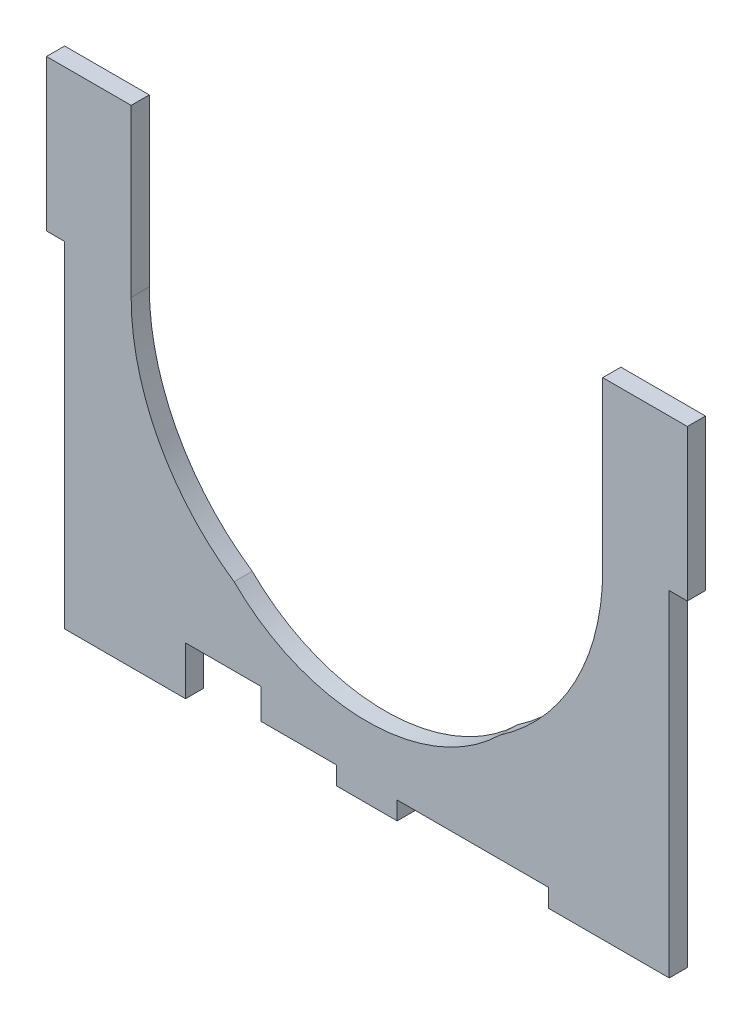
ISO-10303-21;
HEADER;
FILE_DESCRIPTION(('STEP AP214'),'2;1');
FILE_NAME('part.step','',(''),(''),'','','');
FILE_SCHEMA(('AUTOMOTIVE_DESIGN { 1 0 10303 214 1 1 1 1 }'));
ENDSEC;
DATA;
#1=APPLICATION_CONTEXT('core data for automotive mechanical design processes');
#2=APPLICATION_PROTOCOL_DEFINITION('international standard','automotive_design',2000,#1);
#3=PRODUCT_CONTEXT('',#1,'mechanical');
#4=PRODUCT('Part','Part','',(#3));
#5=PRODUCT_RELATED_PRODUCT_CATEGORY('part','',(#4));
#6=PRODUCT_DEFINITION_FORMATION('','',#4);
#7=PRODUCT_DEFINITION_CONTEXT('part definition',#1,'design');
#8=PRODUCT_DEFINITION('design','',#6,#7);
#9=PRODUCT_DEFINITION_SHAPE('','',#8);
#10=(LENGTH_UNIT() NAMED_UNIT(*) SI_UNIT(.MILLI.,.METRE.));
#11=(NAMED_UNIT(*) PLANE_ANGLE_UNIT() SI_UNIT($,.RADIAN.));
#12=(NAMED_UNIT(*) SI_UNIT($,.STERADIAN.) SOLID_ANGLE_UNIT());
#13=UNCERTAINTY_MEASURE_WITH_UNIT(LENGTH_MEASURE(1.E-05),#10,'distance_accuracy_value','');
#14=(GEOMETRIC_REPRESENTATION_CONTEXT(3) GLOBAL_UNCERTAINTY_ASSIGNED_CONTEXT((#13)) GLOBAL_UNIT_ASSIGNED_CONTEXT((#10,
#11,#12)) REPRESENTATION_CONTEXT('',''));
#15=CARTESIAN_POINT('',(0.,0.,0.));
#16=DIRECTION('',(0.,0.,1.));
#17=DIRECTION('',(1.,0.,0.));
#18=AXIS2_PLACEMENT_3D('',#15,#16,#17);
#19=CARTESIAN_POINT('',(0.,0.,6.));
#20=DIRECTION('',(0.,1.,0.));
#21=DIRECTION('',(-1.,0.,0.));
#22=AXIS2_PLACEMENT_3D('',#19,#20,#21);
#23=PLANE('',#22);
#24=DIRECTION('',(1.,0.,0.));
#25=VECTOR('',#24,1.);
#26=CARTESIAN_POINT('',(0.,0.,6.));
#27=LINE('',#26,#25);
#28=CARTESIAN_POINT('',(-135.,0.,6.));
#29=VERTEX_POINT('',#28);
#30=CARTESIAN_POINT('',(-110.,0.,6.));
#31=VERTEX_POINT('',#30);
#32=EDGE_CURVE('E219',#29,#31,#27,.T.);
#33=ORIENTED_EDGE('',*,*,#32,.F.);
#34=DIRECTION('',(0.,0.,1.));
#35=VECTOR('',#34,1.);
#36=CARTESIAN_POINT('',(-135.,0.,-4.));
#37=LINE('',#36,#35);
#38=CARTESIAN_POINT('',(-135.,0.,0.));
#39=VERTEX_POINT('',#38);
#40=EDGE_CURVE('E202',#39,#29,#37,.T.);
#41=ORIENTED_EDGE('',*,*,#40,.F.);
#42=DIRECTION('',(1.,0.,0.));
#43=VECTOR('',#42,1.);
#44=CARTESIAN_POINT('',(0.,0.,0.));
#45=LINE('',#44,#43);
#46=CARTESIAN_POINT('',(-110.,0.,0.));
#47=VERTEX_POINT('',#46);
#48=EDGE_CURVE('E269',#39,#47,#45,.T.);
#49=ORIENTED_EDGE('',*,*,#48,.T.);
#50=DIRECTION('',(0.,0.,1.));
#51=VECTOR('',#50,1.);
#52=CARTESIAN_POINT('',(-110.,0.,0.));
#53=LINE('',#52,#51);
#54=EDGE_CURVE('E225',#47,#31,#53,.T.);
#55=ORIENTED_EDGE('',*,*,#54,.T.);
#56=EDGE_LOOP('',(#33,#41,#49,#55));
#57=FACE_BOUND('',#56,.T.);
#58=ADVANCED_FACE('F42',(#57),#23,.F.);
#59=CARTESIAN_POINT('',(-90.,0.,0.));
#60=VERTEX_POINT('',#59);
#61=CARTESIAN_POINT('',(-40.,0.,0.));
#62=VERTEX_POINT('',#61);
#63=EDGE_CURVE('E63',#60,#62,#45,.T.);
#64=ORIENTED_EDGE('',*,*,#63,.T.);
#65=DIRECTION('',(0.,0.,1.));
#66=VECTOR('',#65,1.);
#67=CARTESIAN_POINT('',(-40.,0.,0.));
#68=LINE('',#67,#66);
#69=CARTESIAN_POINT('',(-40.,0.,6.));
#70=VERTEX_POINT('',#69);
#71=EDGE_CURVE('E58',#62,#70,#68,.T.);
#72=ORIENTED_EDGE('',*,*,#71,.T.);
#73=CARTESIAN_POINT('',(-90.,0.,6.));
#74=VERTEX_POINT('',#73);
#75=EDGE_CURVE('E229',#74,#70,#27,.T.);
#76=ORIENTED_EDGE('',*,*,#75,.F.);
#77=DIRECTION('',(0.,0.,1.));
#78=VECTOR('',#77,1.);
#79=CARTESIAN_POINT('',(-90.,0.,0.));
#80=LINE('',#79,#78);
#81=EDGE_CURVE('E303',#60,#74,#80,.T.);
#82=ORIENTED_EDGE('',*,*,#81,.F.);
#83=EDGE_LOOP('',(#64,#72,#76,#82));
#84=FACE_BOUND('',#83,.T.);
#85=ADVANCED_FACE('F556',(#84),#23,.F.);
#86=CARTESIAN_POINT('',(-200.,0.,6.));
#87=DIRECTION('',(1.,0.,0.));
#88=DIRECTION('',(0.,0.,-1.));
#89=AXIS2_PLACEMENT_3D('',#86,#87,#88);
#90=PLANE('',#89);
#91=DIRECTION('',(0.,0.,1.));
#92=VECTOR('',#91,1.);
#93=CARTESIAN_POINT('',(-200.,105.,0.));
#94=LINE('',#93,#92);
#95=CARTESIAN_POINT('',(-200.,105.,0.));
#96=VERTEX_POINT('',#95);
#97=CARTESIAN_POINT('',(-200.,105.,6.));
#98=VERTEX_POINT('',#97);
#99=EDGE_CURVE('E245',#96,#98,#94,.T.);
#100=ORIENTED_EDGE('',*,*,#99,.F.);
#101=DIRECTION('',(0.,-1.,0.));
#102=VECTOR('',#101,1.);
#103=CARTESIAN_POINT('',(-200.,0.,0.));
#104=LINE('',#103,#102);
#105=CARTESIAN_POINT('',(-200.,-5.99999999999998,0.));
#106=VERTEX_POINT('',#105);
#107=EDGE_CURVE('E266',#96,#106,#104,.T.);
#108=ORIENTED_EDGE('',*,*,#107,.T.);
#109=DIRECTION('',(0.,0.,1.));
#110=VECTOR('',#109,1.);
#111=CARTESIAN_POINT('',(-200.,-5.99999999999998,0.));
#112=LINE('',#111,#110);
#113=CARTESIAN_POINT('',(-200.,-5.99999999999998,6.));
#114=VERTEX_POINT('',#113);
#115=EDGE_CURVE('E346',#106,#114,#112,.T.);
#116=ORIENTED_EDGE('',*,*,#115,.T.);
#117=DIRECTION('',(0.,-1.,0.));
#118=VECTOR('',#117,1.);
#119=CARTESIAN_POINT('',(-200.,0.,6.));
#120=LINE('',#119,#118);
#121=EDGE_CURVE('E236',#98,#114,#120,.T.);
#122=ORIENTED_EDGE('',*,*,#121,.F.);
#123=EDGE_LOOP('',(#100,#108,#116,#122));
#124=FACE_BOUND('',#123,.T.);
#125=ADVANCED_FACE('F439',(#124),#90,.F.);
#126=CARTESIAN_POINT('',(0.,0.,6.));
#127=DIRECTION('',(-1.,0.,0.));
#128=DIRECTION('',(0.,-1.,0.));
#129=AXIS2_PLACEMENT_3D('',#126,#127,#128);
#130=PLANE('',#129);
#131=DIRECTION('',(0.,1.,0.));
#132=VECTOR('',#131,1.);
#133=CARTESIAN_POINT('',(0.,0.,0.));
#134=LINE('',#133,#132);
#135=CARTESIAN_POINT('',(0.,-5.99999999999998,0.));
#136=VERTEX_POINT('',#135);
#137=CARTESIAN_POINT('',(0.,105.,0.));
#138=VERTEX_POINT('',#137);
#139=EDGE_CURVE('E240',#136,#138,#134,.T.);
#140=ORIENTED_EDGE('',*,*,#139,.T.);
#141=DIRECTION('',(0.,0.,1.));
#142=VECTOR('',#141,1.);
#143=CARTESIAN_POINT('',(0.,105.,0.));
#144=LINE('',#143,#142);
#145=CARTESIAN_POINT('',(0.,105.,6.));
#146=VERTEX_POINT('',#145);
#147=EDGE_CURVE('E379',#138,#146,#144,.T.);
#148=ORIENTED_EDGE('',*,*,#147,.T.);
#149=DIRECTION('',(0.,1.,0.));
#150=VECTOR('',#149,1.);
#151=CARTESIAN_POINT('',(0.,0.,6.));
#152=LINE('',#151,#150);
#153=CARTESIAN_POINT('',(0.,-5.99999999999998,6.));
#154=VERTEX_POINT('',#153);
#155=EDGE_CURVE('E271',#154,#146,#152,.T.);
#156=ORIENTED_EDGE('',*,*,#155,.F.);
#157=DIRECTION('',(0.,0.,1.));
#158=VECTOR('',#157,1.);
#159=CARTESIAN_POINT('',(0.,-5.99999999999998,0.));
#160=LINE('',#159,#158);
#161=EDGE_CURVE('E452',#136,#154,#160,.T.);
#162=ORIENTED_EDGE('',*,*,#161,.F.);
#163=EDGE_LOOP('',(#140,#148,#156,#162));
#164=FACE_BOUND('',#163,.T.);
#165=ADVANCED_FACE('F44',(#164),#130,.F.);
#166=CARTESIAN_POINT('',(0.,155.,6.));
#167=DIRECTION('',(0.,-1.,0.));
#168=DIRECTION('',(0.,0.,-1.));
#169=AXIS2_PLACEMENT_3D('',#166,#167,#168);
#170=PLANE('',#169);
#171=DIRECTION('',(-1.,0.,0.));
#172=VECTOR('',#171,1.);
#173=CARTESIAN_POINT('',(0.,155.,0.));
#174=LINE('',#173,#172);
#175=CARTESIAN_POINT('',(6.00000000000003,155.,0.));
#176=VERTEX_POINT('',#175);
#177=CARTESIAN_POINT('',(-21.9999999999999,155.,0.));
#178=VERTEX_POINT('',#177);
#179=EDGE_CURVE('E244',#176,#178,#174,.T.);
#180=ORIENTED_EDGE('',*,*,#179,.T.);
#181=DIRECTION('',(0.,0.,-1.));
#182=VECTOR('',#181,1.);
#183=CARTESIAN_POINT('',(-21.9999999999999,155.,6.));
#184=LINE('',#183,#182);
#185=CARTESIAN_POINT('',(-21.9999999999999,155.,6.));
#186=VERTEX_POINT('',#185);
#187=EDGE_CURVE('E288',#186,#178,#184,.T.);
#188=ORIENTED_EDGE('',*,*,#187,.F.);
#189=DIRECTION('',(-1.,0.,0.));
#190=VECTOR('',#189,1.);
#191=CARTESIAN_POINT('',(0.,155.,6.));
#192=LINE('',#191,#190);
#193=CARTESIAN_POINT('',(6.00000000000003,155.,6.));
#194=VERTEX_POINT('',#193);
#195=EDGE_CURVE('E414',#194,#186,#192,.T.);
#196=ORIENTED_EDGE('',*,*,#195,.F.);
#197=DIRECTION('',(0.,0.,1.));
#198=VECTOR('',#197,1.);
#199=CARTESIAN_POINT('',(6.00000000000003,155.,0.));
#200=LINE('',#199,#198);
#201=EDGE_CURVE('E368',#176,#194,#200,.T.);
#202=ORIENTED_EDGE('',*,*,#201,.F.);
#203=EDGE_LOOP('',(#180,#188,#196,#202));
#204=FACE_BOUND('',#203,.T.);
#205=ADVANCED_FACE('F511',(#204),#170,.F.);
#206=CARTESIAN_POINT('',(-22.,100.,6.));
#207=DIRECTION('',(1.,0.,0.));
#208=DIRECTION('',(0.,1.,0.));
#209=AXIS2_PLACEMENT_3D('',#206,#207,#208);
#210=PLANE('',#209);
#211=DIRECTION('',(0.,-1.,0.));
#212=VECTOR('',#211,1.);
#213=CARTESIAN_POINT('',(-22.,100.,0.));
#214=LINE('',#213,#212);
#215=CARTESIAN_POINT('',(-22.,100.,0.));
#216=VERTEX_POINT('',#215);
#217=EDGE_CURVE('E248',#178,#216,#214,.T.);
#218=ORIENTED_EDGE('',*,*,#217,.T.);
#219=DIRECTION('',(0.,0.,-1.));
#220=VECTOR('',#219,1.);
#221=CARTESIAN_POINT('',(-22.,100.,6.));
#222=LINE('',#221,#220);
#223=CARTESIAN_POINT('',(-22.,100.,6.));
#224=VERTEX_POINT('',#223);
#225=EDGE_CURVE('E284',#224,#216,#222,.T.);
#226=ORIENTED_EDGE('',*,*,#225,.F.);
#227=DIRECTION('',(0.,-1.,0.));
#228=VECTOR('',#227,1.);
#229=CARTESIAN_POINT('',(-22.,100.,6.));
#230=LINE('',#229,#228);
#231=EDGE_CURVE('E417',#186,#224,#230,.T.);
#232=ORIENTED_EDGE('',*,*,#231,.F.);
#233=ORIENTED_EDGE('',*,*,#187,.T.);
#234=EDGE_LOOP('',(#218,#226,#232,#233));
#235=FACE_BOUND('',#234,.T.);
#236=ADVANCED_FACE('F513',(#235),#210,.F.);
#237=CARTESIAN_POINT('',(-100.,100.,6.));
#238=DIRECTION('',(0.,0.,-1.));
#239=DIRECTION('',(-1.,0.,0.));
#240=AXIS2_PLACEMENT_3D('',#237,#238,#239);
#241=CYLINDRICAL_SURFACE('',#240,78.);
#242=CARTESIAN_POINT('',(-100.,100.,0.));
#243=DIRECTION('',(0.,0.,-1.));
#244=DIRECTION('',(1.,0.,0.));
#245=AXIS2_PLACEMENT_3D('',#242,#243,#244);
#246=CIRCLE('',#245,78.);
#247=CARTESIAN_POINT('',(-56.0568198017314,35.55625,0.));
#248=VERTEX_POINT('',#247);
#249=EDGE_CURVE('E251',#216,#248,#246,.T.);
#250=ORIENTED_EDGE('',*,*,#249,.T.);
#251=DIRECTION('',(0.,0.,-1.));
#252=VECTOR('',#251,1.);
#253=CARTESIAN_POINT('',(-56.0568198017314,35.55625,6.));
#254=LINE('',#253,#252);
#255=CARTESIAN_POINT('',(-56.0568198017314,35.55625,6.));
#256=VERTEX_POINT('',#255);
#257=EDGE_CURVE('E280',#256,#248,#254,.T.);
#258=ORIENTED_EDGE('',*,*,#257,.F.);
#259=CARTESIAN_POINT('',(-100.,100.,6.));
#260=DIRECTION('',(0.,0.,-1.));
#261=DIRECTION('',(1.,0.,0.));
#262=AXIS2_PLACEMENT_3D('',#259,#260,#261);
#263=CIRCLE('',#262,78.);
#264=EDGE_CURVE('E420',#224,#256,#263,.T.);
#265=ORIENTED_EDGE('',*,*,#264,.F.);
#266=ORIENTED_EDGE('',*,*,#225,.T.);
#267=EDGE_LOOP('',(#250,#258,#265,#266));
#268=FACE_BOUND('',#267,.T.);
#269=ADVANCED_FACE('F518',(#268),#241,.F.);
#270=CARTESIAN_POINT('',(-100.,80.,6.));
#271=DIRECTION('',(0.,0.,-1.));
#272=DIRECTION('',(-1.,0.,0.));
#273=AXIS2_PLACEMENT_3D('',#270,#271,#272);
#274=CYLINDRICAL_SURFACE('',#273,62.5);
#275=CARTESIAN_POINT('',(-100.,80.,0.));
#276=DIRECTION('',(0.,0.,-1.));
#277=DIRECTION('',(1.,0.,0.));
#278=AXIS2_PLACEMENT_3D('',#275,#276,#277);
#279=CIRCLE('',#278,62.5);
#280=CARTESIAN_POINT('',(-143.943180198269,35.55625,0.));
#281=VERTEX_POINT('',#280);
#282=EDGE_CURVE('E254',#248,#281,#279,.T.);
#283=ORIENTED_EDGE('',*,*,#282,.T.);
#284=DIRECTION('',(0.,0.,-1.));
#285=VECTOR('',#284,1.);
#286=CARTESIAN_POINT('',(-143.943180198269,35.55625,6.));
#287=LINE('',#286,#285);
#288=CARTESIAN_POINT('',(-143.943180198269,35.55625,6.));
#289=VERTEX_POINT('',#288);
#290=EDGE_CURVE('E276',#289,#281,#287,.T.);
#291=ORIENTED_EDGE('',*,*,#290,.F.);
#292=CARTESIAN_POINT('',(-100.,80.,6.));
#293=DIRECTION('',(0.,0.,-1.));
#294=DIRECTION('',(1.,0.,0.));
#295=AXIS2_PLACEMENT_3D('',#292,#293,#294);
#296=CIRCLE('',#295,62.5);
#297=EDGE_CURVE('E423',#256,#289,#296,.T.);
#298=ORIENTED_EDGE('',*,*,#297,.F.);
#299=ORIENTED_EDGE('',*,*,#257,.T.);
#300=EDGE_LOOP('',(#283,#291,#298,#299));
#301=FACE_BOUND('',#300,.T.);
#302=ADVANCED_FACE('F524',(#301),#274,.F.);
#303=CARTESIAN_POINT('',(-100.,100.,6.));
#304=DIRECTION('',(0.,0.,-1.));
#305=DIRECTION('',(-1.,0.,0.));
#306=AXIS2_PLACEMENT_3D('',#303,#304,#305);
#307=CYLINDRICAL_SURFACE('',#306,78.);
#308=CARTESIAN_POINT('',(-100.,100.,0.));
#309=DIRECTION('',(0.,0.,-1.));
#310=DIRECTION('',(1.,0.,0.));
#311=AXIS2_PLACEMENT_3D('',#308,#309,#310);
#312=CIRCLE('',#311,78.);
#313=CARTESIAN_POINT('',(-178.,100.,0.));
#314=VERTEX_POINT('',#313);
#315=EDGE_CURVE('E257',#281,#314,#312,.T.);
#316=ORIENTED_EDGE('',*,*,#315,.T.);
#317=DIRECTION('',(0.,0.,-1.));
#318=VECTOR('',#317,1.);
#319=CARTESIAN_POINT('',(-178.,100.,6.));
#320=LINE('',#319,#318);
#321=CARTESIAN_POINT('',(-178.,100.,6.));
#322=VERTEX_POINT('',#321);
#323=EDGE_CURVE('E234',#322,#314,#320,.T.);
#324=ORIENTED_EDGE('',*,*,#323,.F.);
#325=CARTESIAN_POINT('',(-100.,100.,6.));
#326=DIRECTION('',(0.,0.,-1.));
#327=DIRECTION('',(1.,0.,0.));
#328=AXIS2_PLACEMENT_3D('',#325,#326,#327);
#329=CIRCLE('',#328,78.);
#330=EDGE_CURVE('E426',#289,#322,#329,.T.);
#331=ORIENTED_EDGE('',*,*,#330,.F.);
#332=ORIENTED_EDGE('',*,*,#290,.T.);
#333=EDGE_LOOP('',(#316,#324,#331,#332));
#334=FACE_BOUND('',#333,.T.);
#335=ADVANCED_FACE('F528',(#334),#307,.F.);
#336=CARTESIAN_POINT('',(-178.,100.,6.));
#337=DIRECTION('',(-1.,0.,0.));
#338=DIRECTION('',(0.,-1.,0.));
#339=AXIS2_PLACEMENT_3D('',#336,#337,#338);
#340=PLANE('',#339);
#341=DIRECTION('',(0.,1.,0.));
#342=VECTOR('',#341,1.);
#343=CARTESIAN_POINT('',(-178.,100.,0.));
#344=LINE('',#343,#342);
#345=CARTESIAN_POINT('',(-178.,155.,0.));
#346=VERTEX_POINT('',#345);
#347=EDGE_CURVE('E260',#314,#346,#344,.T.);
#348=ORIENTED_EDGE('',*,*,#347,.T.);
#349=DIRECTION('',(0.,0.,-1.));
#350=VECTOR('',#349,1.);
#351=CARTESIAN_POINT('',(-178.,155.,6.));
#352=LINE('',#351,#350);
#353=CARTESIAN_POINT('',(-178.,155.,6.));
#354=VERTEX_POINT('',#353);
#355=EDGE_CURVE('E228',#354,#346,#352,.T.);
#356=ORIENTED_EDGE('',*,*,#355,.F.);
#357=DIRECTION('',(0.,1.,0.));
#358=VECTOR('',#357,1.);
#359=CARTESIAN_POINT('',(-178.,100.,6.));
#360=LINE('',#359,#358);
#361=EDGE_CURVE('E429',#322,#354,#360,.T.);
#362=ORIENTED_EDGE('',*,*,#361,.F.);
#363=ORIENTED_EDGE('',*,*,#323,.T.);
#364=EDGE_LOOP('',(#348,#356,#362,#363));
#365=FACE_BOUND('',#364,.T.);
#366=ADVANCED_FACE('F533',(#365),#340,.F.);
#367=CARTESIAN_POINT('',(-178.,155.,6.));
#368=DIRECTION('',(0.,-1.,0.));
#369=DIRECTION('',(0.,0.,-1.));
#370=AXIS2_PLACEMENT_3D('',#367,#368,#369);
#371=PLANE('',#370);
#372=DIRECTION('',(-1.,0.,0.));
#373=VECTOR('',#372,1.);
#374=CARTESIAN_POINT('',(-178.,155.,0.));
#375=LINE('',#374,#373);
#376=CARTESIAN_POINT('',(-206.,155.,0.));
#377=VERTEX_POINT('',#376);
#378=EDGE_CURVE('E263',#346,#377,#375,.T.);
#379=ORIENTED_EDGE('',*,*,#378,.T.);
#380=DIRECTION('',(0.,0.,1.));
#381=VECTOR('',#380,1.);
#382=CARTESIAN_POINT('',(-206.,155.,0.));
#383=LINE('',#382,#381);
#384=CARTESIAN_POINT('',(-206.,155.,6.));
#385=VERTEX_POINT('',#384);
#386=EDGE_CURVE('E395',#377,#385,#383,.T.);
#387=ORIENTED_EDGE('',*,*,#386,.T.);
#388=DIRECTION('',(-1.,0.,0.));
#389=VECTOR('',#388,1.);
#390=CARTESIAN_POINT('',(-178.,155.,6.));
#391=LINE('',#390,#389);
#392=EDGE_CURVE('E431',#354,#385,#391,.T.);
#393=ORIENTED_EDGE('',*,*,#392,.F.);
#394=ORIENTED_EDGE('',*,*,#355,.T.);
#395=EDGE_LOOP('',(#379,#387,#393,#394));
#396=FACE_BOUND('',#395,.T.);
#397=ADVANCED_FACE('F536',(#396),#371,.F.);
#398=CARTESIAN_POINT('',(-100.,100.,6.));
#399=DIRECTION('',(0.,0.,1.));
#400=DIRECTION('',(1.,0.,0.));
#401=AXIS2_PLACEMENT_3D('',#398,#399,#400);
#402=PLANE('',#401);
#403=DIRECTION('',(0.,1.,0.));
#404=VECTOR('',#403,1.);
#405=CARTESIAN_POINT('',(-160.,0.,6.));
#406=LINE('',#405,#404);
#407=CARTESIAN_POINT('',(-160.,-5.99999999999998,6.));
#408=VERTEX_POINT('',#407);
#409=CARTESIAN_POINT('',(-160.,10.,6.));
#410=VERTEX_POINT('',#409);
#411=EDGE_CURVE('E343',#408,#410,#406,.T.);
#412=ORIENTED_EDGE('',*,*,#411,.T.);
#413=DIRECTION('',(-1.,0.,0.));
#414=VECTOR('',#413,1.);
#415=CARTESIAN_POINT('',(-160.,10.,6.));
#416=LINE('',#415,#414);
#417=CARTESIAN_POINT('',(-135.,10.,6.));
#418=VERTEX_POINT('',#417);
#419=EDGE_CURVE('E214',#418,#410,#416,.T.);
#420=ORIENTED_EDGE('',*,*,#419,.F.);
#421=DIRECTION('',(0.,1.,0.));
#422=VECTOR('',#421,1.);
#423=CARTESIAN_POINT('',(-135.,0.,6.));
#424=LINE('',#423,#422);
#425=EDGE_CURVE('E206',#29,#418,#424,.T.);
#426=ORIENTED_EDGE('',*,*,#425,.F.);
#427=ORIENTED_EDGE('',*,*,#32,.T.);
#428=DIRECTION('',(0.,-1.,0.));
#429=VECTOR('',#428,1.);
#430=CARTESIAN_POINT('',(-110.,0.,6.));
#431=LINE('',#430,#429);
#432=CARTESIAN_POINT('',(-110.,-5.99999999999998,6.));
#433=VERTEX_POINT('',#432);
#434=EDGE_CURVE('E301',#31,#433,#431,.T.);
#435=ORIENTED_EDGE('',*,*,#434,.T.);
#436=DIRECTION('',(1.,0.,0.));
#437=VECTOR('',#436,1.);
#438=CARTESIAN_POINT('',(-110.,-5.99999999999998,6.));
#439=LINE('',#438,#437);
#440=CARTESIAN_POINT('',(-90.,-5.99999999999997,6.));
#441=VERTEX_POINT('',#440);
#442=EDGE_CURVE('E320',#433,#441,#439,.T.);
#443=ORIENTED_EDGE('',*,*,#442,.T.);
#444=DIRECTION('',(0.,1.,0.));
#445=VECTOR('',#444,1.);
#446=CARTESIAN_POINT('',(-90.,0.,6.));
#447=LINE('',#446,#445);
#448=EDGE_CURVE('E316',#441,#74,#447,.T.);
#449=ORIENTED_EDGE('',*,*,#448,.T.);
#450=ORIENTED_EDGE('',*,*,#75,.T.);
#451=DIRECTION('',(0.,-1.,0.));
#452=VECTOR('',#451,1.);
#453=CARTESIAN_POINT('',(-40.,0.,6.));
#454=LINE('',#453,#452);
#455=CARTESIAN_POINT('',(-40.,-5.99999999999998,6.));
#456=VERTEX_POINT('',#455);
#457=EDGE_CURVE('E304',#70,#456,#454,.T.);
#458=ORIENTED_EDGE('',*,*,#457,.T.);
#459=DIRECTION('',(1.,0.,0.));
#460=VECTOR('',#459,1.);
#461=CARTESIAN_POINT('',(0.,-5.99999999999998,6.));
#462=LINE('',#461,#460);
#463=EDGE_CURVE('E312',#456,#154,#462,.T.);
#464=ORIENTED_EDGE('',*,*,#463,.T.);
#465=ORIENTED_EDGE('',*,*,#155,.T.);
#466=DIRECTION('',(1.,0.,0.));
#467=VECTOR('',#466,1.);
#468=CARTESIAN_POINT('',(6.00000000000003,105.,6.));
#469=LINE('',#468,#467);
#470=CARTESIAN_POINT('',(6.00000000000003,105.,6.));
#471=VERTEX_POINT('',#470);
#472=EDGE_CURVE('E364',#146,#471,#469,.T.);
#473=ORIENTED_EDGE('',*,*,#472,.T.);
#474=DIRECTION('',(0.,1.,0.));
#475=VECTOR('',#474,1.);
#476=CARTESIAN_POINT('',(6.00000000000003,155.,6.));
#477=LINE('',#476,#475);
#478=EDGE_CURVE('E355',#471,#194,#477,.T.);
#479=ORIENTED_EDGE('',*,*,#478,.T.);
#480=ORIENTED_EDGE('',*,*,#195,.T.);
#481=ORIENTED_EDGE('',*,*,#231,.T.);
#482=ORIENTED_EDGE('',*,*,#264,.T.);
#483=ORIENTED_EDGE('',*,*,#297,.T.);
#484=ORIENTED_EDGE('',*,*,#330,.T.);
#485=ORIENTED_EDGE('',*,*,#361,.T.);
#486=ORIENTED_EDGE('',*,*,#392,.T.);
#487=DIRECTION('',(0.,-1.,0.));
#488=VECTOR('',#487,1.);
#489=CARTESIAN_POINT('',(-206.,155.,6.));
#490=LINE('',#489,#488);
#491=CARTESIAN_POINT('',(-206.,105.,6.));
#492=VERTEX_POINT('',#491);
#493=EDGE_CURVE('E378',#385,#492,#490,.T.);
#494=ORIENTED_EDGE('',*,*,#493,.T.);
#495=DIRECTION('',(1.,0.,0.));
#496=VECTOR('',#495,1.);
#497=CARTESIAN_POINT('',(-200.,105.,6.));
#498=LINE('',#497,#496);
#499=EDGE_CURVE('E391',#492,#98,#498,.T.);
#500=ORIENTED_EDGE('',*,*,#499,.T.);
#501=ORIENTED_EDGE('',*,*,#121,.T.);
#502=DIRECTION('',(1.,0.,0.));
#503=VECTOR('',#502,1.);
#504=CARTESIAN_POINT('',(-200.,-5.99999999999998,6.));
#505=LINE('',#504,#503);
#506=EDGE_CURVE('E326',#114,#408,#505,.T.);
#507=ORIENTED_EDGE('',*,*,#506,.T.);
#508=EDGE_LOOP('',(#412,#420,#426,#427,#435,#443,#449,#450,#458,#464,#465,#473,#479,#480,#481,
#482,#483,#484,#485,#486,#494,#500,#501,#507));
#509=FACE_BOUND('',#508,.T.);
#510=ADVANCED_FACE('F217',(#509),#402,.T.);
#511=CARTESIAN_POINT('',(-100.,100.,0.));
#512=DIRECTION('',(0.,0.,1.));
#513=DIRECTION('',(1.,0.,0.));
#514=AXIS2_PLACEMENT_3D('',#511,#512,#513);
#515=PLANE('',#514);
#516=DIRECTION('',(-1.,0.,0.));
#517=VECTOR('',#516,1.);
#518=CARTESIAN_POINT('',(-100.,9.99999999999999,0.));
#519=LINE('',#518,#517);
#520=CARTESIAN_POINT('',(-135.,10.,0.));
#521=VERTEX_POINT('',#520);
#522=CARTESIAN_POINT('',(-160.,10.,0.));
#523=VERTEX_POINT('',#522);
#524=EDGE_CURVE('E11',#521,#523,#519,.T.);
#525=ORIENTED_EDGE('',*,*,#524,.T.);
#526=DIRECTION('',(0.,1.,0.));
#527=VECTOR('',#526,1.);
#528=CARTESIAN_POINT('',(-160.,0.,0.));
#529=LINE('',#528,#527);
#530=CARTESIAN_POINT('',(-160.,-5.99999999999998,0.));
#531=VERTEX_POINT('',#530);
#532=EDGE_CURVE('E342',#531,#523,#529,.T.);
#533=ORIENTED_EDGE('',*,*,#532,.F.);
#534=DIRECTION('',(1.,0.,0.));
#535=VECTOR('',#534,1.);
#536=CARTESIAN_POINT('',(-200.,-5.99999999999998,0.));
#537=LINE('',#536,#535);
#538=EDGE_CURVE('E338',#106,#531,#537,.T.);
#539=ORIENTED_EDGE('',*,*,#538,.F.);
#540=ORIENTED_EDGE('',*,*,#107,.F.);
#541=DIRECTION('',(1.,0.,0.));
#542=VECTOR('',#541,1.);
#543=CARTESIAN_POINT('',(-200.,105.,0.));
#544=LINE('',#543,#542);
#545=CARTESIAN_POINT('',(-206.,105.,0.));
#546=VERTEX_POINT('',#545);
#547=EDGE_CURVE('E390',#546,#96,#544,.T.);
#548=ORIENTED_EDGE('',*,*,#547,.F.);
#549=DIRECTION('',(0.,-1.,0.));
#550=VECTOR('',#549,1.);
#551=CARTESIAN_POINT('',(-206.,155.,0.));
#552=LINE('',#551,#550);
#553=EDGE_CURVE('E386',#377,#546,#552,.T.);
#554=ORIENTED_EDGE('',*,*,#553,.F.);
#555=ORIENTED_EDGE('',*,*,#378,.F.);
#556=ORIENTED_EDGE('',*,*,#347,.F.);
#557=ORIENTED_EDGE('',*,*,#315,.F.);
#558=ORIENTED_EDGE('',*,*,#282,.F.);
#559=ORIENTED_EDGE('',*,*,#249,.F.);
#560=ORIENTED_EDGE('',*,*,#217,.F.);
#561=ORIENTED_EDGE('',*,*,#179,.F.);
#562=DIRECTION('',(0.,1.,0.));
#563=VECTOR('',#562,1.);
#564=CARTESIAN_POINT('',(6.00000000000003,155.,0.));
#565=LINE('',#564,#563);
#566=CARTESIAN_POINT('',(6.00000000000003,105.,0.));
#567=VERTEX_POINT('',#566);
#568=EDGE_CURVE('E359',#567,#176,#565,.T.);
#569=ORIENTED_EDGE('',*,*,#568,.F.);
#570=DIRECTION('',(1.,0.,0.));
#571=VECTOR('',#570,1.);
#572=CARTESIAN_POINT('',(6.00000000000003,105.,0.));
#573=LINE('',#572,#571);
#574=EDGE_CURVE('E363',#138,#567,#573,.T.);
#575=ORIENTED_EDGE('',*,*,#574,.F.);
#576=ORIENTED_EDGE('',*,*,#139,.F.);
#577=DIRECTION('',(1.,0.,0.));
#578=VECTOR('',#577,1.);
#579=CARTESIAN_POINT('',(0.,-5.99999999999998,0.));
#580=LINE('',#579,#578);
#581=CARTESIAN_POINT('',(-40.,-5.99999999999998,0.));
#582=VERTEX_POINT('',#581);
#583=EDGE_CURVE('E462',#582,#136,#580,.T.);
#584=ORIENTED_EDGE('',*,*,#583,.F.);
#585=DIRECTION('',(0.,-1.,0.));
#586=VECTOR('',#585,1.);
#587=CARTESIAN_POINT('',(-40.,0.,0.));
#588=LINE('',#587,#586);
#589=EDGE_CURVE('E471',#62,#582,#588,.T.);
#590=ORIENTED_EDGE('',*,*,#589,.F.);
#591=ORIENTED_EDGE('',*,*,#63,.F.);
#592=DIRECTION('',(0.,1.,0.));
#593=VECTOR('',#592,1.);
#594=CARTESIAN_POINT('',(-90.,0.,0.));
#595=LINE('',#594,#593);
#596=CARTESIAN_POINT('',(-90.,-5.99999999999997,0.));
#597=VERTEX_POINT('',#596);
#598=EDGE_CURVE('E327',#597,#60,#595,.T.);
#599=ORIENTED_EDGE('',*,*,#598,.F.);
#600=DIRECTION('',(1.,0.,0.));
#601=VECTOR('',#600,1.);
#602=CARTESIAN_POINT('',(-110.,-5.99999999999998,0.));
#603=LINE('',#602,#601);
#604=CARTESIAN_POINT('',(-110.,-5.99999999999998,0.));
#605=VERTEX_POINT('',#604);
#606=EDGE_CURVE('E331',#605,#597,#603,.T.);
#607=ORIENTED_EDGE('',*,*,#606,.F.);
#608=DIRECTION('',(0.,-1.,0.));
#609=VECTOR('',#608,1.);
#610=CARTESIAN_POINT('',(-110.,0.,0.));
#611=LINE('',#610,#609);
#612=EDGE_CURVE('E298',#47,#605,#611,.T.);
#613=ORIENTED_EDGE('',*,*,#612,.F.);
#614=ORIENTED_EDGE('',*,*,#48,.F.);
#615=DIRECTION('',(0.,1.,0.));
#616=VECTOR('',#615,1.);
#617=CARTESIAN_POINT('',(-135.,100.,0.));
#618=LINE('',#617,#616);
#619=EDGE_CURVE('E51',#39,#521,#618,.T.);
#620=ORIENTED_EDGE('',*,*,#619,.T.);
#621=EDGE_LOOP('',(#525,#533,#539,#540,#548,#554,#555,#556,#557,#558,#559,#560,#561,#569,#575,
#576,#584,#590,#591,#599,#607,#613,#614,#620));
#622=FACE_BOUND('',#621,.T.);
#623=ADVANCED_FACE('F293',(#622),#515,.F.);
#624=CARTESIAN_POINT('',(-200.,105.,0.));
#625=DIRECTION('',(0.,-1.,0.));
#626=DIRECTION('',(0.,0.,-1.));
#627=AXIS2_PLACEMENT_3D('',#624,#625,#626);
#628=PLANE('',#627);
#629=ORIENTED_EDGE('',*,*,#499,.F.);
#630=DIRECTION('',(0.,0.,1.));
#631=VECTOR('',#630,1.);
#632=CARTESIAN_POINT('',(-206.,105.,0.));
#633=LINE('',#632,#631);
#634=EDGE_CURVE('E405',#546,#492,#633,.T.);
#635=ORIENTED_EDGE('',*,*,#634,.F.);
#636=ORIENTED_EDGE('',*,*,#547,.T.);
#637=ORIENTED_EDGE('',*,*,#99,.T.);
#638=EDGE_LOOP('',(#629,#635,#636,#637));
#639=FACE_BOUND('',#638,.T.);
#640=ADVANCED_FACE('F543',(#639),#628,.T.);
#641=CARTESIAN_POINT('',(-206.,155.,0.));
#642=DIRECTION('',(-1.,0.,0.));
#643=DIRECTION('',(0.,0.,1.));
#644=AXIS2_PLACEMENT_3D('',#641,#642,#643);
#645=PLANE('',#644);
#646=ORIENTED_EDGE('',*,*,#493,.F.);
#647=ORIENTED_EDGE('',*,*,#386,.F.);
#648=ORIENTED_EDGE('',*,*,#553,.T.);
#649=ORIENTED_EDGE('',*,*,#634,.T.);
#650=EDGE_LOOP('',(#646,#647,#648,#649));
#651=FACE_BOUND('',#650,.T.);
#652=ADVANCED_FACE('F541',(#651),#645,.T.);
#653=CARTESIAN_POINT('',(6.00000000000003,155.,0.));
#654=DIRECTION('',(1.,0.,0.));
#655=DIRECTION('',(0.,0.,-1.));
#656=AXIS2_PLACEMENT_3D('',#653,#654,#655);
#657=PLANE('',#656);
#658=ORIENTED_EDGE('',*,*,#478,.F.);
#659=DIRECTION('',(0.,0.,1.));
#660=VECTOR('',#659,1.);
#661=CARTESIAN_POINT('',(6.00000000000003,105.,0.));
#662=LINE('',#661,#660);
#663=EDGE_CURVE('E375',#567,#471,#662,.T.);
#664=ORIENTED_EDGE('',*,*,#663,.F.);
#665=ORIENTED_EDGE('',*,*,#568,.T.);
#666=ORIENTED_EDGE('',*,*,#201,.T.);
#667=EDGE_LOOP('',(#658,#664,#665,#666));
#668=FACE_BOUND('',#667,.T.);
#669=ADVANCED_FACE('F506',(#668),#657,.T.);
#670=CARTESIAN_POINT('',(6.00000000000003,105.,0.));
#671=DIRECTION('',(0.,-1.,0.));
#672=DIRECTION('',(0.,0.,-1.));
#673=AXIS2_PLACEMENT_3D('',#670,#671,#672);
#674=PLANE('',#673);
#675=ORIENTED_EDGE('',*,*,#472,.F.);
#676=ORIENTED_EDGE('',*,*,#147,.F.);
#677=ORIENTED_EDGE('',*,*,#574,.T.);
#678=ORIENTED_EDGE('',*,*,#663,.T.);
#679=EDGE_LOOP('',(#675,#676,#677,#678));
#680=FACE_BOUND('',#679,.T.);
#681=ADVANCED_FACE('F500',(#680),#674,.T.);
#682=CARTESIAN_POINT('',(-160.,0.,0.));
#683=DIRECTION('',(1.,0.,0.));
#684=DIRECTION('',(0.,0.,-1.));
#685=AXIS2_PLACEMENT_3D('',#682,#683,#684);
#686=PLANE('',#685);
#687=ORIENTED_EDGE('',*,*,#411,.F.);
#688=DIRECTION('',(0.,0.,1.));
#689=VECTOR('',#688,1.);
#690=CARTESIAN_POINT('',(-160.,-5.99999999999998,0.));
#691=LINE('',#690,#689);
#692=EDGE_CURVE('E352',#531,#408,#691,.T.);
#693=ORIENTED_EDGE('',*,*,#692,.F.);
#694=ORIENTED_EDGE('',*,*,#532,.T.);
#695=DIRECTION('',(0.,0.,1.));
#696=VECTOR('',#695,1.);
#697=CARTESIAN_POINT('',(-160.,10.,-4.));
#698=LINE('',#697,#696);
#699=EDGE_CURVE('E449',#523,#410,#698,.T.);
#700=ORIENTED_EDGE('',*,*,#699,.T.);
#701=EDGE_LOOP('',(#687,#693,#694,#700));
#702=FACE_BOUND('',#701,.T.);
#703=ADVANCED_FACE('F447',(#702),#686,.T.);
#704=CARTESIAN_POINT('',(-200.,-5.99999999999998,0.));
#705=DIRECTION('',(0.,-1.,0.));
#706=DIRECTION('',(0.,0.,-1.));
#707=AXIS2_PLACEMENT_3D('',#704,#705,#706);
#708=PLANE('',#707);
#709=ORIENTED_EDGE('',*,*,#506,.F.);
#710=ORIENTED_EDGE('',*,*,#115,.F.);
#711=ORIENTED_EDGE('',*,*,#538,.T.);
#712=ORIENTED_EDGE('',*,*,#692,.T.);
#713=EDGE_LOOP('',(#709,#710,#711,#712));
#714=FACE_BOUND('',#713,.T.);
#715=ADVANCED_FACE('F443',(#714),#708,.T.);
#716=CARTESIAN_POINT('',(-110.,0.,0.));
#717=DIRECTION('',(-1.,0.,0.));
#718=DIRECTION('',(0.,0.,1.));
#719=AXIS2_PLACEMENT_3D('',#716,#717,#718);
#720=PLANE('',#719);
#721=ORIENTED_EDGE('',*,*,#434,.F.);
#722=ORIENTED_EDGE('',*,*,#54,.F.);
#723=ORIENTED_EDGE('',*,*,#612,.T.);
#724=DIRECTION('',(0.,0.,1.));
#725=VECTOR('',#724,1.);
#726=CARTESIAN_POINT('',(-110.,-5.99999999999998,0.));
#727=LINE('',#726,#725);
#728=EDGE_CURVE('E332',#605,#433,#727,.T.);
#729=ORIENTED_EDGE('',*,*,#728,.T.);
#730=EDGE_LOOP('',(#721,#722,#723,#729));
#731=FACE_BOUND('',#730,.T.);
#732=ADVANCED_FACE('F300',(#731),#720,.T.);
#733=CARTESIAN_POINT('',(-90.,0.,0.));
#734=DIRECTION('',(1.,0.,0.));
#735=DIRECTION('',(0.,0.,-1.));
#736=AXIS2_PLACEMENT_3D('',#733,#734,#735);
#737=PLANE('',#736);
#738=ORIENTED_EDGE('',*,*,#448,.F.);
#739=DIRECTION('',(0.,0.,1.));
#740=VECTOR('',#739,1.);
#741=CARTESIAN_POINT('',(-90.,-5.99999999999997,0.));
#742=LINE('',#741,#740);
#743=EDGE_CURVE('E309',#597,#441,#742,.T.);
#744=ORIENTED_EDGE('',*,*,#743,.F.);
#745=ORIENTED_EDGE('',*,*,#598,.T.);
#746=ORIENTED_EDGE('',*,*,#81,.T.);
#747=EDGE_LOOP('',(#738,#744,#745,#746));
#748=FACE_BOUND('',#747,.T.);
#749=ADVANCED_FACE('F487',(#748),#737,.T.);
#750=CARTESIAN_POINT('',(-110.,-5.99999999999998,0.));
#751=DIRECTION('',(0.,-1.,0.));
#752=DIRECTION('',(1.,0.,0.));
#753=AXIS2_PLACEMENT_3D('',#750,#751,#752);
#754=PLANE('',#753);
#755=ORIENTED_EDGE('',*,*,#442,.F.);
#756=ORIENTED_EDGE('',*,*,#728,.F.);
#757=ORIENTED_EDGE('',*,*,#606,.T.);
#758=ORIENTED_EDGE('',*,*,#743,.T.);
#759=EDGE_LOOP('',(#755,#756,#757,#758));
#760=FACE_BOUND('',#759,.T.);
#761=ADVANCED_FACE('F484',(#760),#754,.T.);
#762=CARTESIAN_POINT('',(0.,-5.99999999999998,0.));
#763=DIRECTION('',(0.,-1.,0.));
#764=DIRECTION('',(1.,0.,0.));
#765=AXIS2_PLACEMENT_3D('',#762,#763,#764);
#766=PLANE('',#765);
#767=ORIENTED_EDGE('',*,*,#463,.F.);
#768=DIRECTION('',(0.,0.,1.));
#769=VECTOR('',#768,1.);
#770=CARTESIAN_POINT('',(-40.,-5.99999999999998,0.));
#771=LINE('',#770,#769);
#772=EDGE_CURVE('E463',#582,#456,#771,.T.);
#773=ORIENTED_EDGE('',*,*,#772,.F.);
#774=ORIENTED_EDGE('',*,*,#583,.T.);
#775=ORIENTED_EDGE('',*,*,#161,.T.);
#776=EDGE_LOOP('',(#767,#773,#774,#775));
#777=FACE_BOUND('',#776,.T.);
#778=ADVANCED_FACE('F495',(#777),#766,.T.);
#779=CARTESIAN_POINT('',(-40.,0.,0.));
#780=DIRECTION('',(-1.,0.,0.));
#781=DIRECTION('',(0.,0.,1.));
#782=AXIS2_PLACEMENT_3D('',#779,#780,#781);
#783=PLANE('',#782);
#784=ORIENTED_EDGE('',*,*,#457,.F.);
#785=ORIENTED_EDGE('',*,*,#71,.F.);
#786=ORIENTED_EDGE('',*,*,#589,.T.);
#787=ORIENTED_EDGE('',*,*,#772,.T.);
#788=EDGE_LOOP('',(#784,#785,#786,#787));
#789=FACE_BOUND('',#788,.T.);
#790=ADVANCED_FACE('F491',(#789),#783,.T.);
#791=CARTESIAN_POINT('',(-160.,10.,-4.));
#792=DIRECTION('',(0.,1.,0.));
#793=DIRECTION('',(0.,0.,1.));
#794=AXIS2_PLACEMENT_3D('',#791,#792,#793);
#795=PLANE('',#794);
#796=DIRECTION('',(0.,0.,1.));
#797=VECTOR('',#796,1.);
#798=CARTESIAN_POINT('',(-135.,10.,-4.));
#799=LINE('',#798,#797);
#800=EDGE_CURVE('E213',#521,#418,#799,.T.);
#801=ORIENTED_EDGE('',*,*,#800,.T.);
#802=ORIENTED_EDGE('',*,*,#419,.T.);
#803=ORIENTED_EDGE('',*,*,#699,.F.);
#804=ORIENTED_EDGE('',*,*,#524,.F.);
#805=EDGE_LOOP('',(#801,#802,#803,#804));
#806=FACE_BOUND('',#805,.T.);
#807=ADVANCED_FACE('F454',(#806),#795,.F.);
#808=CARTESIAN_POINT('',(-135.,0.,-4.));
#809=DIRECTION('',(1.,0.,0.));
#810=DIRECTION('',(0.,0.,-1.));
#811=AXIS2_PLACEMENT_3D('',#808,#809,#810);
#812=PLANE('',#811);
#813=ORIENTED_EDGE('',*,*,#40,.T.);
#814=ORIENTED_EDGE('',*,*,#425,.T.);
#815=ORIENTED_EDGE('',*,*,#800,.F.);
#816=ORIENTED_EDGE('',*,*,#619,.F.);
#817=EDGE_LOOP('',(#813,#814,#815,#816));
#818=FACE_BOUND('',#817,.T.);
#819=ADVANCED_FACE('F204',(#818),#812,.F.);
#820=CLOSED_SHELL('',(#58,#85,#125,#165,#205,#236,#269,#302,#335,#366,#397,#510,#623,#640,#652,
#669,#681,#703,#715,#732,#749,#761,#778,#790,#807,#819));
#821=MANIFOLD_SOLID_BREP('B2',#820);
#822=ADVANCED_BREP_SHAPE_REPRESENTATION('',(#18,#821),#14);
#823=SHAPE_DEFINITION_REPRESENTATION(#9,#822);
ENDSEC;
END-ISO-10303-21;
